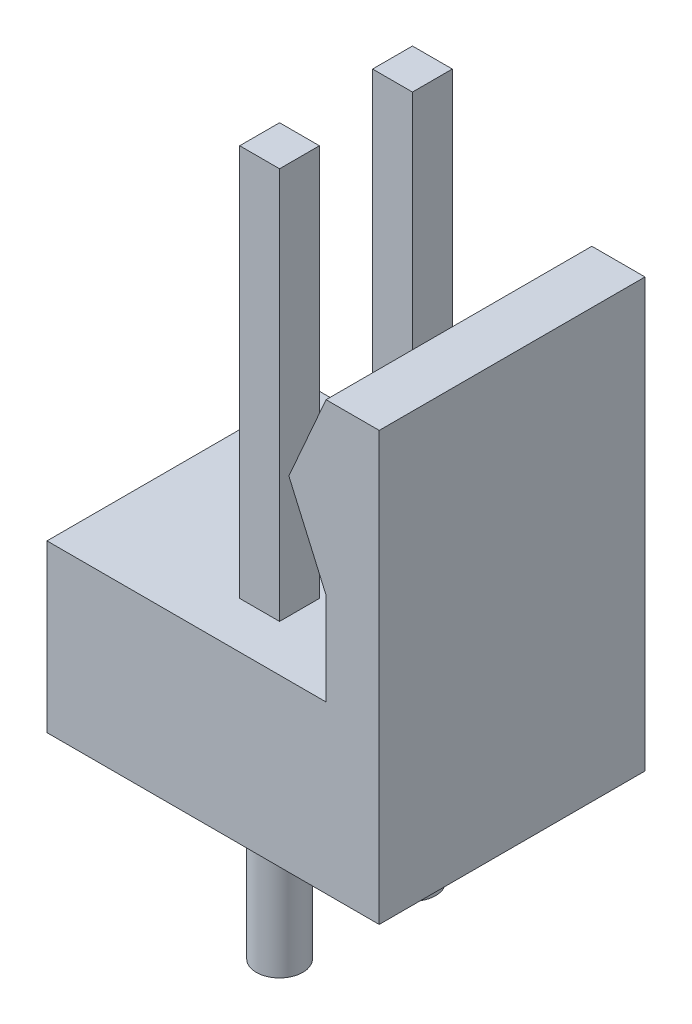
ISO-10303-21;
HEADER;
FILE_DESCRIPTION(('STEP AP214'),'2;1');
FILE_NAME('part.step','',(''),(''),'','','');
FILE_SCHEMA(('AUTOMOTIVE_DESIGN { 1 0 10303 214 1 1 1 1 }'));
ENDSEC;
DATA;
#1=APPLICATION_CONTEXT('core data for automotive mechanical design processes');
#2=APPLICATION_PROTOCOL_DEFINITION('international standard','automotive_design',2000,#1);
#3=PRODUCT_CONTEXT('',#1,'mechanical');
#4=PRODUCT('Part','Part','',(#3));
#5=PRODUCT_RELATED_PRODUCT_CATEGORY('part','',(#4));
#6=PRODUCT_DEFINITION_FORMATION('','',#4);
#7=PRODUCT_DEFINITION_CONTEXT('part definition',#1,'design');
#8=PRODUCT_DEFINITION('design','',#6,#7);
#9=PRODUCT_DEFINITION_SHAPE('','',#8);
#10=(LENGTH_UNIT() NAMED_UNIT(*) SI_UNIT(.MILLI.,.METRE.));
#11=(NAMED_UNIT(*) PLANE_ANGLE_UNIT() SI_UNIT($,.RADIAN.));
#12=(NAMED_UNIT(*) SI_UNIT($,.STERADIAN.) SOLID_ANGLE_UNIT());
#13=UNCERTAINTY_MEASURE_WITH_UNIT(LENGTH_MEASURE(1.E-05),#10,'distance_accuracy_value','');
#14=(GEOMETRIC_REPRESENTATION_CONTEXT(3) GLOBAL_UNCERTAINTY_ASSIGNED_CONTEXT((#13)) GLOBAL_UNIT_ASSIGNED_CONTEXT((#10,
#11,#12)) REPRESENTATION_CONTEXT('',''));
#15=CARTESIAN_POINT('',(0.,0.,0.));
#16=DIRECTION('',(0.,0.,1.));
#17=DIRECTION('',(1.,0.,0.));
#18=AXIS2_PLACEMENT_3D('',#15,#16,#17);
#19=CARTESIAN_POINT('',(-0.381,0.,2.159));
#20=DIRECTION('',(0.,0.,-1.));
#21=DIRECTION('',(-1.,0.,0.));
#22=AXIS2_PLACEMENT_3D('',#19,#20,#21);
#23=PLANE('',#22);
#24=DIRECTION('',(1.,0.,0.));
#25=VECTOR('',#24,1.);
#26=CARTESIAN_POINT('',(0.,10.668,2.159));
#27=LINE('',#26,#25);
#28=CARTESIAN_POINT('',(0.381,10.668,2.159));
#29=VERTEX_POINT('',#28);
#30=CARTESIAN_POINT('',(-0.381,10.668,2.159));
#31=VERTEX_POINT('',#30);
#32=EDGE_CURVE('E143',#29,#31,#27,.F.);
#33=ORIENTED_EDGE('',*,*,#32,.F.);
#34=DIRECTION('',(0.,1.,0.));
#35=VECTOR('',#34,1.);
#36=CARTESIAN_POINT('',(0.381,0.,2.159));
#37=LINE('',#36,#35);
#38=CARTESIAN_POINT('',(0.381,3.175,2.159));
#39=VERTEX_POINT('',#38);
#40=EDGE_CURVE('E126',#39,#29,#37,.T.);
#41=ORIENTED_EDGE('',*,*,#40,.F.);
#42=DIRECTION('',(-1.,0.,0.));
#43=VECTOR('',#42,1.);
#44=CARTESIAN_POINT('',(-0.381,3.175,2.159));
#45=LINE('',#44,#43);
#46=CARTESIAN_POINT('',(-0.381,3.175,2.159));
#47=VERTEX_POINT('',#46);
#48=EDGE_CURVE('E131',#39,#47,#45,.T.);
#49=ORIENTED_EDGE('',*,*,#48,.T.);
#50=DIRECTION('',(0.,1.,0.));
#51=VECTOR('',#50,1.);
#52=CARTESIAN_POINT('',(-0.381,0.,2.159));
#53=LINE('',#52,#51);
#54=EDGE_CURVE('E214',#31,#47,#53,.F.);
#55=ORIENTED_EDGE('',*,*,#54,.F.);
#56=EDGE_LOOP('',(#33,#41,#49,#55));
#57=FACE_BOUND('',#56,.T.);
#58=ADVANCED_FACE('F16',(#57),#23,.T.);
#59=CARTESIAN_POINT('',(-0.381,0.,-0.381));
#60=DIRECTION('',(0.,0.,-1.));
#61=DIRECTION('',(-1.,0.,0.));
#62=AXIS2_PLACEMENT_3D('',#59,#60,#61);
#63=PLANE('',#62);
#64=DIRECTION('',(1.,0.,0.));
#65=VECTOR('',#64,1.);
#66=CARTESIAN_POINT('',(0.,10.668,-0.381));
#67=LINE('',#66,#65);
#68=CARTESIAN_POINT('',(0.381,10.668,-0.381));
#69=VERTEX_POINT('',#68);
#70=CARTESIAN_POINT('',(-0.381,10.668,-0.381));
#71=VERTEX_POINT('',#70);
#72=EDGE_CURVE('E204',#69,#71,#67,.F.);
#73=ORIENTED_EDGE('',*,*,#72,.F.);
#74=DIRECTION('',(0.,1.,0.));
#75=VECTOR('',#74,1.);
#76=CARTESIAN_POINT('',(0.381,0.,-0.381));
#77=LINE('',#76,#75);
#78=CARTESIAN_POINT('',(0.381,3.175,-0.381));
#79=VERTEX_POINT('',#78);
#80=EDGE_CURVE('E209',#79,#69,#77,.T.);
#81=ORIENTED_EDGE('',*,*,#80,.F.);
#82=DIRECTION('',(-1.,0.,0.));
#83=VECTOR('',#82,1.);
#84=CARTESIAN_POINT('',(-0.381,3.175,-0.381));
#85=LINE('',#84,#83);
#86=CARTESIAN_POINT('',(-0.381,3.175,-0.381));
#87=VERTEX_POINT('',#86);
#88=EDGE_CURVE('E141',#79,#87,#85,.T.);
#89=ORIENTED_EDGE('',*,*,#88,.T.);
#90=DIRECTION('',(0.,1.,0.));
#91=VECTOR('',#90,1.);
#92=CARTESIAN_POINT('',(-0.381,0.,-0.381));
#93=LINE('',#92,#91);
#94=EDGE_CURVE('E196',#71,#87,#93,.F.);
#95=ORIENTED_EDGE('',*,*,#94,.F.);
#96=EDGE_LOOP('',(#73,#81,#89,#95));
#97=FACE_BOUND('',#96,.T.);
#98=ADVANCED_FACE('F383',(#97),#63,.T.);
#99=CARTESIAN_POINT('',(0.381,0.,2.159));
#100=DIRECTION('',(1.,0.,0.));
#101=DIRECTION('',(0.,0.,-1.));
#102=AXIS2_PLACEMENT_3D('',#99,#100,#101);
#103=PLANE('',#102);
#104=DIRECTION('',(0.,0.,1.));
#105=VECTOR('',#104,1.);
#106=CARTESIAN_POINT('',(0.381,10.668,2.54));
#107=LINE('',#106,#105);
#108=CARTESIAN_POINT('',(0.381,10.668,2.921));
#109=VERTEX_POINT('',#108);
#110=EDGE_CURVE('E145',#109,#29,#107,.F.);
#111=ORIENTED_EDGE('',*,*,#110,.F.);
#112=DIRECTION('',(0.,1.,0.));
#113=VECTOR('',#112,1.);
#114=CARTESIAN_POINT('',(0.381,0.,2.921));
#115=LINE('',#114,#113);
#116=CARTESIAN_POINT('',(0.381,3.175,2.921));
#117=VERTEX_POINT('',#116);
#118=EDGE_CURVE('E149',#117,#109,#115,.T.);
#119=ORIENTED_EDGE('',*,*,#118,.F.);
#120=DIRECTION('',(0.,0.,-1.));
#121=VECTOR('',#120,1.);
#122=CARTESIAN_POINT('',(0.381,3.175,2.159));
#123=LINE('',#122,#121);
#124=EDGE_CURVE('E135',#117,#39,#123,.T.);
#125=ORIENTED_EDGE('',*,*,#124,.T.);
#126=ORIENTED_EDGE('',*,*,#40,.T.);
#127=EDGE_LOOP('',(#111,#119,#125,#126));
#128=FACE_BOUND('',#127,.T.);
#129=ADVANCED_FACE('F147',(#128),#103,.T.);
#130=CARTESIAN_POINT('',(0.,10.668,2.54));
#131=DIRECTION('',(0.,1.,0.));
#132=DIRECTION('',(0.,0.,1.));
#133=AXIS2_PLACEMENT_3D('',#130,#131,#132);
#134=PLANE('',#133);
#135=ORIENTED_EDGE('',*,*,#110,.T.);
#136=ORIENTED_EDGE('',*,*,#32,.T.);
#137=DIRECTION('',(0.,0.,1.));
#138=VECTOR('',#137,1.);
#139=CARTESIAN_POINT('',(-0.381,10.668,2.921));
#140=LINE('',#139,#138);
#141=CARTESIAN_POINT('',(-0.381,10.668,2.921));
#142=VERTEX_POINT('',#141);
#143=EDGE_CURVE('E216',#142,#31,#140,.F.);
#144=ORIENTED_EDGE('',*,*,#143,.F.);
#145=DIRECTION('',(1.,0.,0.));
#146=VECTOR('',#145,1.);
#147=CARTESIAN_POINT('',(0.381,10.668,2.921));
#148=LINE('',#147,#146);
#149=EDGE_CURVE('E192',#109,#142,#148,.F.);
#150=ORIENTED_EDGE('',*,*,#149,.F.);
#151=EDGE_LOOP('',(#135,#136,#144,#150));
#152=FACE_BOUND('',#151,.T.);
#153=ADVANCED_FACE('F222',(#152),#134,.T.);
#154=CARTESIAN_POINT('',(-0.381,0.,2.921));
#155=DIRECTION('',(-1.,0.,0.));
#156=DIRECTION('',(0.,0.,1.));
#157=AXIS2_PLACEMENT_3D('',#154,#155,#156);
#158=PLANE('',#157);
#159=ORIENTED_EDGE('',*,*,#143,.T.);
#160=ORIENTED_EDGE('',*,*,#54,.T.);
#161=DIRECTION('',(0.,0.,1.));
#162=VECTOR('',#161,1.);
#163=CARTESIAN_POINT('',(-0.381,3.175,2.921));
#164=LINE('',#163,#162);
#165=CARTESIAN_POINT('',(-0.381,3.175,2.921));
#166=VERTEX_POINT('',#165);
#167=EDGE_CURVE('E137',#47,#166,#164,.T.);
#168=ORIENTED_EDGE('',*,*,#167,.T.);
#169=DIRECTION('',(0.,1.,0.));
#170=VECTOR('',#169,1.);
#171=CARTESIAN_POINT('',(-0.381,0.,2.921));
#172=LINE('',#171,#170);
#173=EDGE_CURVE('E189',#142,#166,#172,.F.);
#174=ORIENTED_EDGE('',*,*,#173,.F.);
#175=EDGE_LOOP('',(#159,#160,#168,#174));
#176=FACE_BOUND('',#175,.T.);
#177=ADVANCED_FACE('F376',(#176),#158,.T.);
#178=CARTESIAN_POINT('',(0.381,0.,-0.381));
#179=DIRECTION('',(1.,0.,0.));
#180=DIRECTION('',(0.,0.,-1.));
#181=AXIS2_PLACEMENT_3D('',#178,#179,#180);
#182=PLANE('',#181);
#183=DIRECTION('',(0.,0.,1.));
#184=VECTOR('',#183,1.);
#185=CARTESIAN_POINT('',(0.381,10.668,0.));
#186=LINE('',#185,#184);
#187=CARTESIAN_POINT('',(0.381,10.668,0.381));
#188=VERTEX_POINT('',#187);
#189=EDGE_CURVE('E206',#188,#69,#186,.F.);
#190=ORIENTED_EDGE('',*,*,#189,.F.);
#191=DIRECTION('',(0.,1.,0.));
#192=VECTOR('',#191,1.);
#193=CARTESIAN_POINT('',(0.381,0.,0.381));
#194=LINE('',#193,#192);
#195=CARTESIAN_POINT('',(0.381,3.175,0.381));
#196=VERTEX_POINT('',#195);
#197=EDGE_CURVE('E183',#196,#188,#194,.T.);
#198=ORIENTED_EDGE('',*,*,#197,.F.);
#199=DIRECTION('',(0.,0.,-1.));
#200=VECTOR('',#199,1.);
#201=CARTESIAN_POINT('',(0.381,3.175,-0.381));
#202=LINE('',#201,#200);
#203=EDGE_CURVE('E211',#196,#79,#202,.T.);
#204=ORIENTED_EDGE('',*,*,#203,.T.);
#205=ORIENTED_EDGE('',*,*,#80,.T.);
#206=EDGE_LOOP('',(#190,#198,#204,#205));
#207=FACE_BOUND('',#206,.T.);
#208=ADVANCED_FACE('F342',(#207),#182,.T.);
#209=CARTESIAN_POINT('',(0.,10.668,0.));
#210=DIRECTION('',(0.,1.,0.));
#211=DIRECTION('',(0.,0.,1.));
#212=AXIS2_PLACEMENT_3D('',#209,#210,#211);
#213=PLANE('',#212);
#214=ORIENTED_EDGE('',*,*,#189,.T.);
#215=ORIENTED_EDGE('',*,*,#72,.T.);
#216=DIRECTION('',(0.,0.,1.));
#217=VECTOR('',#216,1.);
#218=CARTESIAN_POINT('',(-0.381,10.668,0.381));
#219=LINE('',#218,#217);
#220=CARTESIAN_POINT('',(-0.381,10.668,0.381));
#221=VERTEX_POINT('',#220);
#222=EDGE_CURVE('E199',#221,#71,#219,.F.);
#223=ORIENTED_EDGE('',*,*,#222,.F.);
#224=DIRECTION('',(1.,0.,0.));
#225=VECTOR('',#224,1.);
#226=CARTESIAN_POINT('',(0.381,10.668,0.381));
#227=LINE('',#226,#225);
#228=EDGE_CURVE('E176',#188,#221,#227,.F.);
#229=ORIENTED_EDGE('',*,*,#228,.F.);
#230=EDGE_LOOP('',(#214,#215,#223,#229));
#231=FACE_BOUND('',#230,.T.);
#232=ADVANCED_FACE('F369',(#231),#213,.T.);
#233=CARTESIAN_POINT('',(-0.381,0.,0.381));
#234=DIRECTION('',(-1.,0.,0.));
#235=DIRECTION('',(0.,0.,1.));
#236=AXIS2_PLACEMENT_3D('',#233,#234,#235);
#237=PLANE('',#236);
#238=ORIENTED_EDGE('',*,*,#222,.T.);
#239=ORIENTED_EDGE('',*,*,#94,.T.);
#240=DIRECTION('',(0.,0.,1.));
#241=VECTOR('',#240,1.);
#242=CARTESIAN_POINT('',(-0.381,3.175,0.381));
#243=LINE('',#242,#241);
#244=CARTESIAN_POINT('',(-0.381,3.175,0.381));
#245=VERTEX_POINT('',#244);
#246=EDGE_CURVE('E202',#87,#245,#243,.T.);
#247=ORIENTED_EDGE('',*,*,#246,.T.);
#248=DIRECTION('',(0.,1.,0.));
#249=VECTOR('',#248,1.);
#250=CARTESIAN_POINT('',(-0.381,0.,0.381));
#251=LINE('',#250,#249);
#252=EDGE_CURVE('E172',#221,#245,#251,.F.);
#253=ORIENTED_EDGE('',*,*,#252,.F.);
#254=EDGE_LOOP('',(#238,#239,#247,#253));
#255=FACE_BOUND('',#254,.T.);
#256=ADVANCED_FACE('F365',(#255),#237,.T.);
#257=CARTESIAN_POINT('',(0.,-2.794,2.54));
#258=DIRECTION('',(0.,1.,0.));
#259=DIRECTION('',(0.,0.,1.));
#260=AXIS2_PLACEMENT_3D('',#257,#258,#259);
#261=PLANE('',#260);
#262=CARTESIAN_POINT('',(0.,-2.794,2.54));
#263=DIRECTION('',(0.,-1.,0.));
#264=DIRECTION('',(0.,0.,-1.));
#265=AXIS2_PLACEMENT_3D('',#262,#263,#264);
#266=CIRCLE('',#265,0.4445);
#267=CARTESIAN_POINT('',(0.,-2.794,2.0955));
#268=VERTEX_POINT('',#267);
#269=EDGE_CURVE('E19',#268,#268,#266,.F.);
#270=ORIENTED_EDGE('',*,*,#269,.F.);
#271=EDGE_LOOP('',(#270));
#272=FACE_BOUND('',#271,.T.);
#273=ADVANCED_FACE('F361',(#272),#261,.F.);
#274=CARTESIAN_POINT('',(0.,-2.794,0.));
#275=DIRECTION('',(0.,1.,0.));
#276=DIRECTION('',(0.,0.,1.));
#277=AXIS2_PLACEMENT_3D('',#274,#275,#276);
#278=PLANE('',#277);
#279=CARTESIAN_POINT('',(0.,-2.794,0.));
#280=DIRECTION('',(0.,-1.,0.));
#281=DIRECTION('',(0.,0.,-1.));
#282=AXIS2_PLACEMENT_3D('',#279,#280,#281);
#283=CIRCLE('',#282,0.4445);
#284=CARTESIAN_POINT('',(0.,-2.794,-0.4445));
#285=VERTEX_POINT('',#284);
#286=EDGE_CURVE('E163',#285,#285,#283,.F.);
#287=ORIENTED_EDGE('',*,*,#286,.F.);
#288=EDGE_LOOP('',(#287));
#289=FACE_BOUND('',#288,.T.);
#290=ADVANCED_FACE('F355',(#289),#278,.F.);
#291=CARTESIAN_POINT('',(0.381,0.,2.921));
#292=DIRECTION('',(0.,0.,1.));
#293=DIRECTION('',(1.,0.,0.));
#294=AXIS2_PLACEMENT_3D('',#291,#292,#293);
#295=PLANE('',#294);
#296=ORIENTED_EDGE('',*,*,#149,.T.);
#297=ORIENTED_EDGE('',*,*,#173,.T.);
#298=DIRECTION('',(1.,0.,0.));
#299=VECTOR('',#298,1.);
#300=CARTESIAN_POINT('',(-3.175,3.175,2.921));
#301=LINE('',#300,#299);
#302=EDGE_CURVE('E226',#117,#166,#301,.F.);
#303=ORIENTED_EDGE('',*,*,#302,.F.);
#304=ORIENTED_EDGE('',*,*,#118,.T.);
#305=EDGE_LOOP('',(#296,#297,#303,#304));
#306=FACE_BOUND('',#305,.T.);
#307=ADVANCED_FACE('F225',(#306),#295,.T.);
#308=CARTESIAN_POINT('',(0.381,0.,0.381));
#309=DIRECTION('',(0.,0.,1.));
#310=DIRECTION('',(1.,0.,0.));
#311=AXIS2_PLACEMENT_3D('',#308,#309,#310);
#312=PLANE('',#311);
#313=ORIENTED_EDGE('',*,*,#228,.T.);
#314=ORIENTED_EDGE('',*,*,#252,.T.);
#315=DIRECTION('',(1.,0.,0.));
#316=VECTOR('',#315,1.);
#317=CARTESIAN_POINT('',(-3.175,3.175,0.381));
#318=LINE('',#317,#316);
#319=EDGE_CURVE('E227',#196,#245,#318,.F.);
#320=ORIENTED_EDGE('',*,*,#319,.F.);
#321=ORIENTED_EDGE('',*,*,#197,.T.);
#322=EDGE_LOOP('',(#313,#314,#320,#321));
#323=FACE_BOUND('',#322,.T.);
#324=ADVANCED_FACE('F344',(#323),#312,.T.);
#325=CARTESIAN_POINT('',(0.,0.,2.54));
#326=DIRECTION('',(0.,-1.,0.));
#327=DIRECTION('',(0.,0.,-1.));
#328=AXIS2_PLACEMENT_3D('',#325,#326,#327);
#329=CYLINDRICAL_SURFACE('',#328,0.4445);
#330=CARTESIAN_POINT('',(0.,0.,2.54));
#331=DIRECTION('',(0.,-1.,0.));
#332=DIRECTION('',(0.,0.,-1.));
#333=AXIS2_PLACEMENT_3D('',#330,#331,#332);
#334=CIRCLE('',#333,0.4445);
#335=CARTESIAN_POINT('',(0.,0.,2.0955));
#336=VERTEX_POINT('',#335);
#337=EDGE_CURVE('E160',#336,#336,#334,.F.);
#338=ORIENTED_EDGE('',*,*,#337,.F.);
#339=EDGE_LOOP('',(#338));
#340=FACE_BOUND('',#339,.T.);
#341=ORIENTED_EDGE('',*,*,#269,.T.);
#342=EDGE_LOOP('',(#341));
#343=FACE_BOUND('',#342,.T.);
#344=ADVANCED_FACE('F346',(#340,#343),#329,.T.);
#345=CARTESIAN_POINT('',(0.,0.,0.));
#346=DIRECTION('',(0.,-1.,0.));
#347=DIRECTION('',(0.,0.,-1.));
#348=AXIS2_PLACEMENT_3D('',#345,#346,#347);
#349=CYLINDRICAL_SURFACE('',#348,0.4445);
#350=CARTESIAN_POINT('',(0.,0.,0.));
#351=DIRECTION('',(0.,-1.,0.));
#352=DIRECTION('',(0.,0.,-1.));
#353=AXIS2_PLACEMENT_3D('',#350,#351,#352);
#354=CIRCLE('',#353,0.4445);
#355=CARTESIAN_POINT('',(0.,0.,-0.4445));
#356=VERTEX_POINT('',#355);
#357=EDGE_CURVE('E156',#356,#356,#354,.F.);
#358=ORIENTED_EDGE('',*,*,#357,.F.);
#359=EDGE_LOOP('',(#358));
#360=FACE_BOUND('',#359,.T.);
#361=ORIENTED_EDGE('',*,*,#286,.T.);
#362=EDGE_LOOP('',(#361));
#363=FACE_BOUND('',#362,.T.);
#364=ADVANCED_FACE('F352',(#360,#363),#349,.T.);
#365=CARTESIAN_POINT('',(-3.175,0.,0.));
#366=DIRECTION('',(-1.,0.,0.));
#367=DIRECTION('',(0.,0.,1.));
#368=AXIS2_PLACEMENT_3D('',#365,#366,#367);
#369=PLANE('',#368);
#370=DIRECTION('',(0.,0.,-1.));
#371=VECTOR('',#370,1.);
#372=CARTESIAN_POINT('',(-3.175,0.,0.));
#373=LINE('',#372,#371);
#374=CARTESIAN_POINT('',(-3.175,0.,3.81));
#375=VERTEX_POINT('',#374);
#376=CARTESIAN_POINT('',(-3.175,0.,-1.27));
#377=VERTEX_POINT('',#376);
#378=EDGE_CURVE('E162',#375,#377,#373,.T.);
#379=ORIENTED_EDGE('',*,*,#378,.F.);
#380=DIRECTION('',(0.,1.,0.));
#381=VECTOR('',#380,1.);
#382=CARTESIAN_POINT('',(-3.175,3.20537195816544,3.81));
#383=LINE('',#382,#381);
#384=CARTESIAN_POINT('',(-3.175,3.175,3.81));
#385=VERTEX_POINT('',#384);
#386=EDGE_CURVE('E283',#385,#375,#383,.F.);
#387=ORIENTED_EDGE('',*,*,#386,.F.);
#388=DIRECTION('',(0.,0.,1.));
#389=VECTOR('',#388,1.);
#390=CARTESIAN_POINT('',(-3.175,3.175,0.));
#391=LINE('',#390,#389);
#392=CARTESIAN_POINT('',(-3.175,3.175,-1.27));
#393=VERTEX_POINT('',#392);
#394=EDGE_CURVE('E228',#393,#385,#391,.T.);
#395=ORIENTED_EDGE('',*,*,#394,.F.);
#396=DIRECTION('',(0.,1.,0.));
#397=VECTOR('',#396,1.);
#398=CARTESIAN_POINT('',(-3.175,3.20537195816544,-1.27));
#399=LINE('',#398,#397);
#400=EDGE_CURVE('E258',#393,#377,#399,.F.);
#401=ORIENTED_EDGE('',*,*,#400,.T.);
#402=EDGE_LOOP('',(#379,#387,#395,#401));
#403=FACE_BOUND('',#402,.T.);
#404=ADVANCED_FACE('F310',(#403),#369,.T.);
#405=CARTESIAN_POINT('',(1.4478,6.56066538978969,0.));
#406=DIRECTION('',(-0.915477472248253,0.402369230689859,0.));
#407=DIRECTION('',(-0.402369230689859,-0.915477472248253,0.));
#408=AXIS2_PLACEMENT_3D('',#405,#406,#407);
#409=PLANE('',#408);
#410=DIRECTION('',(0.,0.,1.));
#411=VECTOR('',#410,1.);
#412=CARTESIAN_POINT('',(1.4478,6.56066538978969,0.));
#413=LINE('',#412,#411);
#414=CARTESIAN_POINT('',(1.4478,6.56066538978969,3.81));
#415=VERTEX_POINT('',#414);
#416=CARTESIAN_POINT('',(1.4478,6.56066538978969,-1.27));
#417=VERTEX_POINT('',#416);
#418=EDGE_CURVE('E165',#415,#417,#413,.F.);
#419=ORIENTED_EDGE('',*,*,#418,.F.);
#420=DIRECTION('',(-0.402369230689859,-0.915477472248253,0.));
#421=VECTOR('',#420,1.);
#422=CARTESIAN_POINT('',(2.159,8.1788,3.81));
#423=LINE('',#422,#421);
#424=CARTESIAN_POINT('',(2.159,8.1788,3.81));
#425=VERTEX_POINT('',#424);
#426=EDGE_CURVE('E287',#425,#415,#423,.T.);
#427=ORIENTED_EDGE('',*,*,#426,.F.);
#428=DIRECTION('',(0.,0.,1.));
#429=VECTOR('',#428,1.);
#430=CARTESIAN_POINT('',(2.159,8.1788,0.));
#431=LINE('',#430,#429);
#432=CARTESIAN_POINT('',(2.159,8.1788,-1.27));
#433=VERTEX_POINT('',#432);
#434=EDGE_CURVE('E279',#433,#425,#431,.T.);
#435=ORIENTED_EDGE('',*,*,#434,.F.);
#436=DIRECTION('',(-0.402369230689859,-0.915477472248253,0.));
#437=VECTOR('',#436,1.);
#438=CARTESIAN_POINT('',(2.159,8.1788,-1.27));
#439=LINE('',#438,#437);
#440=EDGE_CURVE('E159',#433,#417,#439,.T.);
#441=ORIENTED_EDGE('',*,*,#440,.T.);
#442=EDGE_LOOP('',(#419,#427,#435,#441));
#443=FACE_BOUND('',#442,.T.);
#444=ADVANCED_FACE('F306',(#443),#409,.T.);
#445=CARTESIAN_POINT('',(2.159,4.94253077957938,0.));
#446=DIRECTION('',(-0.915477472248253,-0.402369230689858,0.));
#447=DIRECTION('',(0.402369230689858,-0.915477472248253,0.));
#448=AXIS2_PLACEMENT_3D('',#445,#446,#447);
#449=PLANE('',#448);
#450=DIRECTION('',(0.,0.,1.));
#451=VECTOR('',#450,1.);
#452=CARTESIAN_POINT('',(2.159,4.94253077957938,0.));
#453=LINE('',#452,#451);
#454=CARTESIAN_POINT('',(2.159,4.94253077957938,3.81));
#455=VERTEX_POINT('',#454);
#456=CARTESIAN_POINT('',(2.159,4.94253077957938,-1.27));
#457=VERTEX_POINT('',#456);
#458=EDGE_CURVE('E169',#455,#457,#453,.F.);
#459=ORIENTED_EDGE('',*,*,#458,.F.);
#460=DIRECTION('',(0.402369230689859,-0.915477472248253,0.));
#461=VECTOR('',#460,1.);
#462=CARTESIAN_POINT('',(1.4478,6.56066538978969,3.81));
#463=LINE('',#462,#461);
#464=EDGE_CURVE('E290',#415,#455,#463,.T.);
#465=ORIENTED_EDGE('',*,*,#464,.F.);
#466=ORIENTED_EDGE('',*,*,#418,.T.);
#467=DIRECTION('',(0.402369230689859,-0.915477472248253,0.));
#468=VECTOR('',#467,1.);
#469=CARTESIAN_POINT('',(1.4478,6.56066538978969,-1.27));
#470=LINE('',#469,#468);
#471=EDGE_CURVE('E253',#417,#457,#470,.T.);
#472=ORIENTED_EDGE('',*,*,#471,.T.);
#473=EDGE_LOOP('',(#459,#465,#466,#472));
#474=FACE_BOUND('',#473,.T.);
#475=ADVANCED_FACE('F311',(#474),#449,.T.);
#476=CARTESIAN_POINT('',(2.159,3.175,0.));
#477=DIRECTION('',(-1.,0.,0.));
#478=DIRECTION('',(0.,0.,1.));
#479=AXIS2_PLACEMENT_3D('',#476,#477,#478);
#480=PLANE('',#479);
#481=DIRECTION('',(0.,0.,1.));
#482=VECTOR('',#481,1.);
#483=CARTESIAN_POINT('',(2.159,3.175,0.));
#484=LINE('',#483,#482);
#485=CARTESIAN_POINT('',(2.159,3.175,3.81));
#486=VERTEX_POINT('',#485);
#487=CARTESIAN_POINT('',(2.159,3.175,-1.27));
#488=VERTEX_POINT('',#487);
#489=EDGE_CURVE('E232',#486,#488,#484,.F.);
#490=ORIENTED_EDGE('',*,*,#489,.F.);
#491=DIRECTION('',(0.,1.,0.));
#492=VECTOR('',#491,1.);
#493=CARTESIAN_POINT('',(2.159,3.20537195816544,3.81));
#494=LINE('',#493,#492);
#495=EDGE_CURVE('E244',#455,#486,#494,.F.);
#496=ORIENTED_EDGE('',*,*,#495,.F.);
#497=ORIENTED_EDGE('',*,*,#458,.T.);
#498=DIRECTION('',(0.,1.,0.));
#499=VECTOR('',#498,1.);
#500=CARTESIAN_POINT('',(2.159,3.20537195816544,-1.27));
#501=LINE('',#500,#499);
#502=EDGE_CURVE('E242',#457,#488,#501,.F.);
#503=ORIENTED_EDGE('',*,*,#502,.T.);
#504=EDGE_LOOP('',(#490,#496,#497,#503));
#505=FACE_BOUND('',#504,.T.);
#506=ADVANCED_FACE('F241',(#505),#480,.T.);
#507=CARTESIAN_POINT('',(-3.175,3.175,0.));
#508=DIRECTION('',(0.,1.,0.));
#509=DIRECTION('',(0.,0.,1.));
#510=AXIS2_PLACEMENT_3D('',#507,#508,#509);
#511=PLANE('',#510);
#512=ORIENTED_EDGE('',*,*,#203,.F.);
#513=ORIENTED_EDGE('',*,*,#319,.T.);
#514=ORIENTED_EDGE('',*,*,#246,.F.);
#515=ORIENTED_EDGE('',*,*,#88,.F.);
#516=EDGE_LOOP('',(#512,#513,#514,#515));
#517=FACE_BOUND('',#516,.T.);
#518=ORIENTED_EDGE('',*,*,#124,.F.);
#519=ORIENTED_EDGE('',*,*,#302,.T.);
#520=ORIENTED_EDGE('',*,*,#167,.F.);
#521=ORIENTED_EDGE('',*,*,#48,.F.);
#522=EDGE_LOOP('',(#518,#519,#520,#521));
#523=FACE_BOUND('',#522,.T.);
#524=ORIENTED_EDGE('',*,*,#394,.T.);
#525=DIRECTION('',(1.,0.,0.));
#526=VECTOR('',#525,1.);
#527=CARTESIAN_POINT('',(0.888334427063991,3.175,3.81));
#528=LINE('',#527,#526);
#529=EDGE_CURVE('E293',#486,#385,#528,.F.);
#530=ORIENTED_EDGE('',*,*,#529,.F.);
#531=ORIENTED_EDGE('',*,*,#489,.T.);
#532=DIRECTION('',(1.,0.,0.));
#533=VECTOR('',#532,1.);
#534=CARTESIAN_POINT('',(0.888334427063991,3.175,-1.27));
#535=LINE('',#534,#533);
#536=EDGE_CURVE('E256',#488,#393,#535,.F.);
#537=ORIENTED_EDGE('',*,*,#536,.T.);
#538=EDGE_LOOP('',(#524,#530,#531,#537));
#539=FACE_BOUND('',#538,.T.);
#540=ADVANCED_FACE('F132',(#517,#523,#539),#511,.T.);
#541=CARTESIAN_POINT('',(3.175,0.,0.));
#542=DIRECTION('',(0.,-1.,0.));
#543=DIRECTION('',(0.,0.,-1.));
#544=AXIS2_PLACEMENT_3D('',#541,#542,#543);
#545=PLANE('',#544);
#546=ORIENTED_EDGE('',*,*,#357,.T.);
#547=EDGE_LOOP('',(#546));
#548=FACE_BOUND('',#547,.T.);
#549=ORIENTED_EDGE('',*,*,#337,.T.);
#550=EDGE_LOOP('',(#549));
#551=FACE_BOUND('',#550,.T.);
#552=DIRECTION('',(0.,0.,-1.));
#553=VECTOR('',#552,1.);
#554=CARTESIAN_POINT('',(3.175,0.,0.));
#555=LINE('',#554,#553);
#556=CARTESIAN_POINT('',(3.175,0.,3.81));
#557=VERTEX_POINT('',#556);
#558=CARTESIAN_POINT('',(3.175,0.,-1.27));
#559=VERTEX_POINT('',#558);
#560=EDGE_CURVE('E296',#557,#559,#555,.T.);
#561=ORIENTED_EDGE('',*,*,#560,.F.);
#562=DIRECTION('',(1.,0.,0.));
#563=VECTOR('',#562,1.);
#564=CARTESIAN_POINT('',(0.888334427063991,0.,3.81));
#565=LINE('',#564,#563);
#566=EDGE_CURVE('E270',#375,#557,#565,.T.);
#567=ORIENTED_EDGE('',*,*,#566,.F.);
#568=ORIENTED_EDGE('',*,*,#378,.T.);
#569=DIRECTION('',(1.,0.,0.));
#570=VECTOR('',#569,1.);
#571=CARTESIAN_POINT('',(0.888334427063991,0.,-1.27));
#572=LINE('',#571,#570);
#573=EDGE_CURVE('E267',#377,#559,#572,.T.);
#574=ORIENTED_EDGE('',*,*,#573,.T.);
#575=EDGE_LOOP('',(#561,#567,#568,#574));
#576=FACE_BOUND('',#575,.T.);
#577=ADVANCED_FACE('F266',(#548,#551,#576),#545,.T.);
#578=CARTESIAN_POINT('',(0.888334427063991,3.20537195816544,-1.27));
#579=DIRECTION('',(0.,0.,1.));
#580=DIRECTION('',(1.,0.,0.));
#581=AXIS2_PLACEMENT_3D('',#578,#579,#580);
#582=PLANE('',#581);
#583=ORIENTED_EDGE('',*,*,#573,.F.);
#584=ORIENTED_EDGE('',*,*,#400,.F.);
#585=ORIENTED_EDGE('',*,*,#536,.F.);
#586=ORIENTED_EDGE('',*,*,#502,.F.);
#587=ORIENTED_EDGE('',*,*,#471,.F.);
#588=ORIENTED_EDGE('',*,*,#440,.F.);
#589=DIRECTION('',(1.,0.,0.));
#590=VECTOR('',#589,1.);
#591=CARTESIAN_POINT('',(2.159,8.1788,-1.27));
#592=LINE('',#591,#590);
#593=CARTESIAN_POINT('',(3.175,8.1788,-1.27));
#594=VERTEX_POINT('',#593);
#595=EDGE_CURVE('E276',#594,#433,#592,.F.);
#596=ORIENTED_EDGE('',*,*,#595,.F.);
#597=DIRECTION('',(0.,1.,0.));
#598=VECTOR('',#597,1.);
#599=CARTESIAN_POINT('',(3.175,8.1788,-1.27));
#600=LINE('',#599,#598);
#601=EDGE_CURVE('E274',#559,#594,#600,.T.);
#602=ORIENTED_EDGE('',*,*,#601,.F.);
#603=EDGE_LOOP('',(#583,#584,#585,#586,#587,#588,#596,#602));
#604=FACE_BOUND('',#603,.T.);
#605=ADVANCED_FACE('F252',(#604),#582,.F.);
#606=CARTESIAN_POINT('',(2.159,8.1788,0.));
#607=DIRECTION('',(0.,1.,0.));
#608=DIRECTION('',(0.,0.,1.));
#609=AXIS2_PLACEMENT_3D('',#606,#607,#608);
#610=PLANE('',#609);
#611=ORIENTED_EDGE('',*,*,#434,.T.);
#612=DIRECTION('',(1.,0.,0.));
#613=VECTOR('',#612,1.);
#614=CARTESIAN_POINT('',(0.888334427063991,8.1788,3.81));
#615=LINE('',#614,#613);
#616=CARTESIAN_POINT('',(3.175,8.1788,3.81));
#617=VERTEX_POINT('',#616);
#618=EDGE_CURVE('E34',#617,#425,#615,.F.);
#619=ORIENTED_EDGE('',*,*,#618,.F.);
#620=DIRECTION('',(0.,0.,-1.));
#621=VECTOR('',#620,1.);
#622=CARTESIAN_POINT('',(3.175,8.1788,0.));
#623=LINE('',#622,#621);
#624=EDGE_CURVE('E25',#594,#617,#623,.F.);
#625=ORIENTED_EDGE('',*,*,#624,.F.);
#626=ORIENTED_EDGE('',*,*,#595,.T.);
#627=EDGE_LOOP('',(#611,#619,#625,#626));
#628=FACE_BOUND('',#627,.T.);
#629=ADVANCED_FACE('F302',(#628),#610,.T.);
#630=CARTESIAN_POINT('',(0.888334427063991,3.20537195816544,3.81));
#631=DIRECTION('',(0.,0.,1.));
#632=DIRECTION('',(1.,0.,0.));
#633=AXIS2_PLACEMENT_3D('',#630,#631,#632);
#634=PLANE('',#633);
#635=ORIENTED_EDGE('',*,*,#495,.T.);
#636=ORIENTED_EDGE('',*,*,#529,.T.);
#637=ORIENTED_EDGE('',*,*,#386,.T.);
#638=ORIENTED_EDGE('',*,*,#566,.T.);
#639=DIRECTION('',(0.,1.,0.));
#640=VECTOR('',#639,1.);
#641=CARTESIAN_POINT('',(3.175,8.1788,3.81));
#642=LINE('',#641,#640);
#643=EDGE_CURVE('E11',#617,#557,#642,.F.);
#644=ORIENTED_EDGE('',*,*,#643,.F.);
#645=ORIENTED_EDGE('',*,*,#618,.T.);
#646=ORIENTED_EDGE('',*,*,#426,.T.);
#647=ORIENTED_EDGE('',*,*,#464,.T.);
#648=EDGE_LOOP('',(#635,#636,#637,#638,#644,#645,#646,#647));
#649=FACE_BOUND('',#648,.T.);
#650=ADVANCED_FACE('F308',(#649),#634,.T.);
#651=CARTESIAN_POINT('',(3.175,8.1788,0.));
#652=DIRECTION('',(1.,0.,0.));
#653=DIRECTION('',(0.,0.,-1.));
#654=AXIS2_PLACEMENT_3D('',#651,#652,#653);
#655=PLANE('',#654);
#656=ORIENTED_EDGE('',*,*,#624,.T.);
#657=ORIENTED_EDGE('',*,*,#643,.T.);
#658=ORIENTED_EDGE('',*,*,#560,.T.);
#659=ORIENTED_EDGE('',*,*,#601,.T.);
#660=EDGE_LOOP('',(#656,#657,#658,#659));
#661=FACE_BOUND('',#660,.T.);
#662=ADVANCED_FACE('F301',(#661),#655,.T.);
#663=CLOSED_SHELL('',(#58,#98,#129,#153,#177,#208,#232,#256,#273,#290,#307,#324,#344,#364,#404,
#444,#475,#506,#540,#577,#605,#629,#650,#662));
#664=MANIFOLD_SOLID_BREP('B1',#663);
#665=ADVANCED_BREP_SHAPE_REPRESENTATION('',(#18,#664),#14);
#666=SHAPE_DEFINITION_REPRESENTATION(#9,#665);
ENDSEC;
END-ISO-10303-21;
